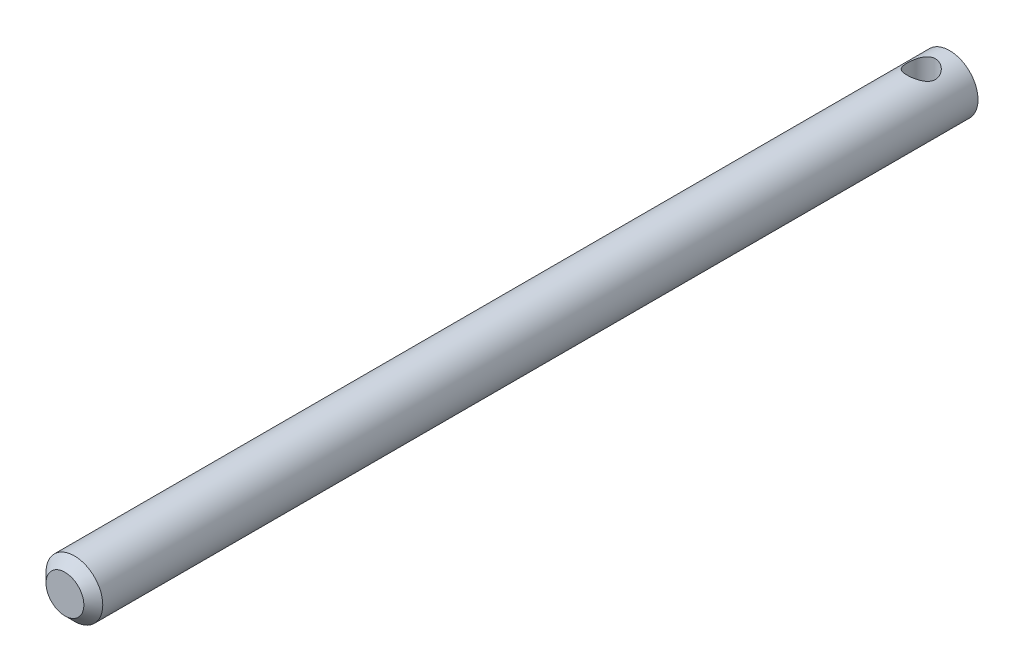
ISO-10303-21;
HEADER;
FILE_DESCRIPTION(('STEP AP214'),'2;1');
FILE_NAME('part.step','',(''),(''),'','','');
FILE_SCHEMA(('AUTOMOTIVE_DESIGN { 1 0 10303 214 1 1 1 1 }'));
ENDSEC;
DATA;
#1=APPLICATION_CONTEXT('core data for automotive mechanical design processes');
#2=APPLICATION_PROTOCOL_DEFINITION('international standard','automotive_design',2000,#1);
#3=PRODUCT_CONTEXT('',#1,'mechanical');
#4=PRODUCT('Part','Part','',(#3));
#5=PRODUCT_RELATED_PRODUCT_CATEGORY('part','',(#4));
#6=PRODUCT_DEFINITION_FORMATION('','',#4);
#7=PRODUCT_DEFINITION_CONTEXT('part definition',#1,'design');
#8=PRODUCT_DEFINITION('design','',#6,#7);
#9=PRODUCT_DEFINITION_SHAPE('','',#8);
#10=(LENGTH_UNIT() NAMED_UNIT(*) SI_UNIT(.MILLI.,.METRE.));
#11=(NAMED_UNIT(*) PLANE_ANGLE_UNIT() SI_UNIT($,.RADIAN.));
#12=(NAMED_UNIT(*) SI_UNIT($,.STERADIAN.) SOLID_ANGLE_UNIT());
#13=UNCERTAINTY_MEASURE_WITH_UNIT(LENGTH_MEASURE(1.E-05),#10,'distance_accuracy_value','');
#14=(GEOMETRIC_REPRESENTATION_CONTEXT(3) GLOBAL_UNCERTAINTY_ASSIGNED_CONTEXT((#13)) GLOBAL_UNIT_ASSIGNED_CONTEXT((#10,
#11,#12)) REPRESENTATION_CONTEXT('',''));
#15=CARTESIAN_POINT('',(0.,0.,0.));
#16=DIRECTION('',(0.,0.,1.));
#17=DIRECTION('',(1.,0.,0.));
#18=AXIS2_PLACEMENT_3D('',#15,#16,#17);
#19=CARTESIAN_POINT('',(0.,0.,93.5));
#20=DIRECTION('',(0.,0.,-1.));
#21=DIRECTION('',(-1.,0.,0.));
#22=AXIS2_PLACEMENT_3D('',#19,#20,#21);
#23=CYLINDRICAL_SURFACE('',#22,3.);
#24=CARTESIAN_POINT('',(0.,0.,92.5));
#25=DIRECTION('',(0.,0.,1.));
#26=DIRECTION('',(1.,0.,0.));
#27=AXIS2_PLACEMENT_3D('',#24,#25,#26);
#28=CIRCLE('',#27,3.);
#29=CARTESIAN_POINT('',(3.,0.,92.5));
#30=VERTEX_POINT('',#29);
#31=EDGE_CURVE('E10',#30,#30,#28,.F.);
#32=ORIENTED_EDGE('',*,*,#31,.T.);
#33=EDGE_LOOP('',(#32));
#34=FACE_BOUND('',#33,.T.);
#35=CARTESIAN_POINT('',(0.,-3.,4.5));
#36=CARTESIAN_POINT('',(0.0788579444268506,-2.99999570107562,4.49999504652421));
#37=CARTESIAN_POINT('',(0.157809899546344,-2.99685736529635,4.49374489031842));
#38=CARTESIAN_POINT('',(0.313380352903345,-2.98461234055736,4.46902067948769));
#39=CARTESIAN_POINT('',(0.389994130070445,-2.97549431743379,4.45052341050328));
#40=CARTESIAN_POINT('',(0.538400317320674,-2.95224419105063,4.40220928707506));
#41=CARTESIAN_POINT('',(0.61021020440872,-2.93813158766306,4.37243642362805));
#42=CARTESIAN_POINT('',(0.747708925209898,-2.90618664773642,4.30264406795252));
#43=CARTESIAN_POINT('',(0.813398240985089,-2.88835460450288,4.2626253836267));
#44=CARTESIAN_POINT('',(0.941261726642864,-2.84934387387093,4.17072412577207));
#45=CARTESIAN_POINT('',(1.00298281668316,-2.82802798691306,4.11827028114054));
#46=CARTESIAN_POINT('',(1.11716916730047,-2.78489955370115,4.00421778112945));
#47=CARTESIAN_POINT('',(1.16962737466015,-2.76308664313552,3.94261222234134));
#48=CARTESIAN_POINT('',(1.26787800067542,-2.71948426796021,3.80627497571493));
#49=CARTESIAN_POINT('',(1.31283800332746,-2.69782780455198,3.73089585248113));
#50=CARTESIAN_POINT('',(1.38925234033604,-2.65928968158481,3.57244899602068));
#51=CARTESIAN_POINT('',(1.4207163224495,-2.64240461410484,3.48938680691588));
#52=CARTESIAN_POINT('',(1.46719866328288,-2.61686800556713,3.32300234186712));
#53=CARTESIAN_POINT('',(1.48308878562066,-2.6077840737557,3.23999332189891));
#54=CARTESIAN_POINT('',(1.50064048996327,-2.59772834922792,3.07203174333079));
#55=CARTESIAN_POINT('',(1.50231613255961,-2.59674854014932,2.98708118869327));
#56=CARTESIAN_POINT('',(1.49203093075844,-2.60266395385873,2.82857096352695));
#57=CARTESIAN_POINT('',(1.48167683930523,-2.6086314549302,2.75486395316542));
#58=CARTESIAN_POINT('',(1.4504097735854,-2.62614343100775,2.61041713594044));
#59=CARTESIAN_POINT('',(1.42949343584648,-2.63768968247664,2.53967828204203));
#60=CARTESIAN_POINT('',(1.37731467057901,-2.66531214619112,2.40115630115151));
#61=CARTESIAN_POINT('',(1.34582260067399,-2.68148760995998,2.33348040182132));
#62=CARTESIAN_POINT('',(1.273562531502,-2.71655106422106,2.20404856111499));
#63=CARTESIAN_POINT('',(1.2327903657187,-2.73544027170286,2.14229529659987));
#64=CARTESIAN_POINT('',(1.13709908236918,-2.77669736854929,2.01821812088516));
#65=CARTESIAN_POINT('',(1.08104168755392,-2.79920265355119,1.95681468963576));
#66=CARTESIAN_POINT('',(0.959333368112061,-2.84321434950611,1.84389687211365));
#67=CARTESIAN_POINT('',(0.893677884861429,-2.86472027938201,1.79238721194918));
#68=CARTESIAN_POINT('',(0.750774758747774,-2.90552980924446,1.69847150845541));
#69=CARTESIAN_POINT('',(0.673130387399114,-2.92468476243011,1.65659929133139));
#70=CARTESIAN_POINT('',(0.510699323233196,-2.95736821681863,1.58685445643549));
#71=CARTESIAN_POINT('',(0.425918364397915,-2.9709011841533,1.55897072247725));
#72=CARTESIAN_POINT('',(0.259149737491054,-2.98986500612153,1.52028689442498));
#73=CARTESIAN_POINT('',(0.17751229582249,-2.99587407451965,1.50826314637983));
#74=CARTESIAN_POINT('',(0.0131693999240285,-3.00109520188655,1.49780290329827));
#75=CARTESIAN_POINT('',(-0.0695355298048621,-3.00031048081978,1.4993599715408));
#76=CARTESIAN_POINT('',(-0.226849457978979,-2.99236788380152,1.51531003262812));
#77=CARTESIAN_POINT('',(-0.301589112074894,-2.98570868532253,1.52869879909499));
#78=CARTESIAN_POINT('',(-0.447610338452911,-2.9673325697226,1.56635710784268));
#79=CARTESIAN_POINT('',(-0.518891528536629,-2.95561509501618,1.59062784968024));
#80=CARTESIAN_POINT('',(-0.658332912674358,-2.92776377120382,1.64999769964955));
#81=CARTESIAN_POINT('',(-0.726345595508704,-2.91151322654446,1.68538657517443));
#82=CARTESIAN_POINT('',(-0.855692042548907,-2.87615961476126,1.76566130346985));
#83=CARTESIAN_POINT('',(-0.917022944664886,-2.85705533350407,1.81055120189309));
#84=CARTESIAN_POINT('',(-1.03765153393382,-2.81562332004297,1.91364063799607));
#85=CARTESIAN_POINT('',(-1.09615811672854,-2.79316327265249,1.97271430266772));
#86=CARTESIAN_POINT('',(-1.20278448167828,-2.7489358741323,2.09988772691659));
#87=CARTESIAN_POINT('',(-1.25089707856781,-2.72716901100071,2.16799367827188));
#88=CARTESIAN_POINT('',(-1.33756187171853,-2.68576788309734,2.31546548125946));
#89=CARTESIAN_POINT('',(-1.37553824370037,-2.66628794383591,2.39521689914172));
#90=CARTESIAN_POINT('',(-1.43712423890206,-2.63361108441202,2.56126510136245));
#91=CARTESIAN_POINT('',(-1.46075237380052,-2.62040607332625,2.64755328970033));
#92=CARTESIAN_POINT('',(-1.49079253120031,-2.60342251538703,2.81536533432706));
#93=CARTESIAN_POINT('',(-1.49863949460818,-2.59886075197597,2.89655138015286));
#94=CARTESIAN_POINT('',(-1.5010337315643,-2.59748031962405,3.05917060074679));
#95=CARTESIAN_POINT('',(-1.49558676993486,-2.60065829439585,3.14060365310679));
#96=CARTESIAN_POINT('',(-1.47288918838996,-2.61356793076615,3.29322525230016));
#97=CARTESIAN_POINT('',(-1.45681247151455,-2.62264641723988,3.36465070521711));
#98=CARTESIAN_POINT('',(-1.41476303733662,-2.64556524281479,3.50371217913655));
#99=CARTESIAN_POINT('',(-1.38878713673988,-2.65940711354503,3.57134697313805));
#100=CARTESIAN_POINT('',(-1.32572361795085,-2.69142795546804,3.7059372764798));
#101=CARTESIAN_POINT('',(-1.28800670672355,-2.70983583593881,3.77254185274354));
#102=CARTESIAN_POINT('',(-1.20322645745609,-2.74852997452291,3.89891180427189));
#103=CARTESIAN_POINT('',(-1.15615825686234,-2.76881720693416,3.95867359578167));
#104=CARTESIAN_POINT('',(-1.04730498999206,-2.81193484737138,4.07721297353201));
#105=CARTESIAN_POINT('',(-0.984426634495891,-2.83477474959942,4.13498865352544));
#106=CARTESIAN_POINT('',(-0.849232209349795,-2.87816628389896,4.2393944751529));
#107=CARTESIAN_POINT('',(-0.776911084957796,-2.89871667939293,4.28601860920486));
#108=CARTESIAN_POINT('',(-0.623897395174418,-2.93547014349806,4.3668545440681));
#109=CARTESIAN_POINT('',(-0.543149255665096,-2.95164144740899,4.4009762538547));
#110=CARTESIAN_POINT('',(-0.37611315170713,-2.9775201194848,4.45471225163611));
#111=CARTESIAN_POINT('',(-0.28984169938365,-2.98724585044602,4.47436777020857));
#112=CARTESIAN_POINT('',(-0.168902919736342,-2.99543192870217,4.49084611662861));
#113=CARTESIAN_POINT('',(-0.135242819162346,-2.99714048010376,4.49427396129951));
#114=CARTESIAN_POINT('',(-0.0677275977076364,-2.99942545465223,4.49885199827113));
#115=CARTESIAN_POINT('',(-0.0338724714699419,-3.00000184655071,4.50000212770531));
#116=CARTESIAN_POINT('',(0.,-3.,4.5));
#117=B_SPLINE_CURVE_WITH_KNOTS('',3,(#35,#36,#37,#38,#39,#40,#41,#42,#43,#44,#45,#46,#47,#48,
#49,#50,#51,#52,#53,#54,#55,#56,#57,#58,#59,#60,#61,#62,#63,#64,#65,#66,#67,#68,#69,#70,#71,#72,
#73,#74,#75,#76,#77,#78,#79,#80,#81,#82,#83,#84,#85,#86,#87,#88,#89,#90,#91,#92,#93,#94,#95,#96,
#97,#98,#99,#100,#101,#102,#103,#104,#105,#106,#107,#108,#109,#110,#111,#112,#113,#114,#115,
#116),.UNSPECIFIED.,.T.,.F.,(4,2,2,2,2,2,2,2,2,2,2,2,2,2,2,2,2,2,2,2,2,2,2,2,2,2,2,2,2,2,2,2,2,
2,2,2,2,2,2,2,4),(0.,0.236436386130439,0.473322224563796,0.709293233238447,0.945245640872351,
1.19547263807713,1.44588935648105,1.71572589646129,1.98536921847421,2.23887018210344,
2.49212035993531,2.71508568613981,2.93812205888518,3.16635360252731,3.39468781890333,
3.65197412000818,3.90938301898029,4.17874533321661,4.44789325368419,4.69474935707018,
4.94148846767214,5.16910359759183,5.39674382446397,5.63089284041848,5.86514176122509,
6.12239415966628,6.37982382923148,6.64972023242589,6.91926767918176,7.1629396125457,
7.40650589797018,7.62686895373284,7.84730293182527,8.08254685170431,8.31791341715446,
8.58187864135757,8.84598575071869,9.1119602049529,9.37717362931724,9.47872920200876,
9.58028757766599),.UNSPECIFIED.);
#118=CARTESIAN_POINT('',(0.,-3.,4.5));
#119=VERTEX_POINT('',#118);
#120=EDGE_CURVE('E44',#119,#119,#117,.T.);
#121=ORIENTED_EDGE('',*,*,#120,.T.);
#122=EDGE_LOOP('',(#121));
#123=FACE_BOUND('',#122,.T.);
#124=CARTESIAN_POINT('',(0.,3.,4.5));
#125=CARTESIAN_POINT('',(-0.0788579444268503,2.99999570107561,4.49999504652421));
#126=CARTESIAN_POINT('',(-0.157809899546344,2.99685736529635,4.49374489031842));
#127=CARTESIAN_POINT('',(-0.313380352903344,2.98461234055736,4.46902067948769));
#128=CARTESIAN_POINT('',(-0.389994130070445,2.97549431743379,4.45052341050328));
#129=CARTESIAN_POINT('',(-0.538400317320674,2.95224419105063,4.40220928707506));
#130=CARTESIAN_POINT('',(-0.61021020440872,2.93813158766306,4.37243642362805));
#131=CARTESIAN_POINT('',(-0.747708925209898,2.90618664773642,4.30264406795252));
#132=CARTESIAN_POINT('',(-0.813398240985089,2.88835460450288,4.2626253836267));
#133=CARTESIAN_POINT('',(-0.941261726642864,2.84934387387093,4.17072412577207));
#134=CARTESIAN_POINT('',(-1.00298281668316,2.82802798691306,4.11827028114054));
#135=CARTESIAN_POINT('',(-1.11716916730047,2.78489955370115,4.00421778112944));
#136=CARTESIAN_POINT('',(-1.16962737466015,2.76308664313552,3.94261222234134));
#137=CARTESIAN_POINT('',(-1.26787800067542,2.71948426796021,3.80627497571493));
#138=CARTESIAN_POINT('',(-1.31283800332746,2.69782780455198,3.73089585248113));
#139=CARTESIAN_POINT('',(-1.38925234033604,2.65928968158481,3.57244899602068));
#140=CARTESIAN_POINT('',(-1.4207163224495,2.64240461410484,3.48938680691588));
#141=CARTESIAN_POINT('',(-1.46719866328288,2.61686800556713,3.32300234186712));
#142=CARTESIAN_POINT('',(-1.48308878562066,2.6077840737557,3.23999332189891));
#143=CARTESIAN_POINT('',(-1.50064048996327,2.59772834922792,3.07203174333078));
#144=CARTESIAN_POINT('',(-1.50231613255961,2.59674854014932,2.98708118869327));
#145=CARTESIAN_POINT('',(-1.49203093075844,2.60266395385873,2.82857096352695));
#146=CARTESIAN_POINT('',(-1.48167683930523,2.6086314549302,2.75486395316542));
#147=CARTESIAN_POINT('',(-1.4504097735854,2.62614343100775,2.61041713594044));
#148=CARTESIAN_POINT('',(-1.42949343584648,2.63768968247664,2.53967828204203));
#149=CARTESIAN_POINT('',(-1.377314670579,2.66531214619112,2.40115630115151));
#150=CARTESIAN_POINT('',(-1.34582260067399,2.68148760995998,2.33348040182132));
#151=CARTESIAN_POINT('',(-1.273562531502,2.71655106422106,2.20404856111499));
#152=CARTESIAN_POINT('',(-1.2327903657187,2.73544027170286,2.14229529659987));
#153=CARTESIAN_POINT('',(-1.13709908236918,2.77669736854929,2.01821812088516));
#154=CARTESIAN_POINT('',(-1.08104168755392,2.79920265355119,1.95681468963576));
#155=CARTESIAN_POINT('',(-0.959333368112059,2.84321434950611,1.84389687211365));
#156=CARTESIAN_POINT('',(-0.893677884861427,2.86472027938201,1.79238721194918));
#157=CARTESIAN_POINT('',(-0.750774758747771,2.90552980924446,1.69847150845541));
#158=CARTESIAN_POINT('',(-0.673130387399112,2.92468476243011,1.65659929133139));
#159=CARTESIAN_POINT('',(-0.510699323233194,2.95736821681863,1.58685445643549));
#160=CARTESIAN_POINT('',(-0.425918364397913,2.9709011841533,1.55897072247725));
#161=CARTESIAN_POINT('',(-0.259149737491052,2.98986500612153,1.52028689442498));
#162=CARTESIAN_POINT('',(-0.177512295822488,2.99587407451965,1.50826314637983));
#163=CARTESIAN_POINT('',(-0.0131693999240264,3.00109520188655,1.49780290329827));
#164=CARTESIAN_POINT('',(0.0695355298048642,3.00031048081978,1.4993599715408));
#165=CARTESIAN_POINT('',(0.226849457978982,2.99236788380152,1.51531003262812));
#166=CARTESIAN_POINT('',(0.301589112074896,2.98570868532252,1.52869879909499));
#167=CARTESIAN_POINT('',(0.447610338452913,2.9673325697226,1.56635710784268));
#168=CARTESIAN_POINT('',(0.518891528536632,2.95561509501618,1.59062784968024));
#169=CARTESIAN_POINT('',(0.65833291267436,2.92776377120382,1.64999769964955));
#170=CARTESIAN_POINT('',(0.726345595508706,2.91151322654446,1.68538657517443));
#171=CARTESIAN_POINT('',(0.855692042548909,2.87615961476126,1.76566130346985));
#172=CARTESIAN_POINT('',(0.917022944664889,2.85705533350407,1.81055120189309));
#173=CARTESIAN_POINT('',(1.03765153393382,2.81562332004297,1.91364063799608));
#174=CARTESIAN_POINT('',(1.09615811672854,2.79316327265249,1.97271430266772));
#175=CARTESIAN_POINT('',(1.20278448167828,2.7489358741323,2.09988772691659));
#176=CARTESIAN_POINT('',(1.25089707856781,2.72716901100071,2.16799367827188));
#177=CARTESIAN_POINT('',(1.33756187171853,2.68576788309734,2.31546548125946));
#178=CARTESIAN_POINT('',(1.37553824370037,2.66628794383591,2.39521689914172));
#179=CARTESIAN_POINT('',(1.43712423890206,2.63361108441202,2.56126510136245));
#180=CARTESIAN_POINT('',(1.46075237380053,2.62040607332625,2.64755328970034));
#181=CARTESIAN_POINT('',(1.49079253120031,2.60342251538703,2.81536533432706));
#182=CARTESIAN_POINT('',(1.49863949460818,2.59886075197597,2.89655138015286));
#183=CARTESIAN_POINT('',(1.5010337315643,2.59748031962405,3.05917060074679));
#184=CARTESIAN_POINT('',(1.49558676993486,2.60065829439585,3.14060365310679));
#185=CARTESIAN_POINT('',(1.47288918838996,2.61356793076615,3.29322525230016));
#186=CARTESIAN_POINT('',(1.45681247151455,2.62264641723988,3.36465070521711));
#187=CARTESIAN_POINT('',(1.41476303733662,2.64556524281479,3.50371217913655));
#188=CARTESIAN_POINT('',(1.38878713673988,2.65940711354503,3.57134697313805));
#189=CARTESIAN_POINT('',(1.32572361795085,2.69142795546804,3.70593727647981));
#190=CARTESIAN_POINT('',(1.28800670672355,2.70983583593881,3.77254185274354));
#191=CARTESIAN_POINT('',(1.20322645745609,2.74852997452291,3.89891180427189));
#192=CARTESIAN_POINT('',(1.15615825686234,2.76881720693416,3.95867359578167));
#193=CARTESIAN_POINT('',(1.04730498999206,2.81193484737138,4.07721297353201));
#194=CARTESIAN_POINT('',(0.984426634495891,2.83477474959942,4.13498865352544));
#195=CARTESIAN_POINT('',(0.849232209349795,2.87816628389896,4.2393944751529));
#196=CARTESIAN_POINT('',(0.776911084957795,2.89871667939293,4.28601860920486));
#197=CARTESIAN_POINT('',(0.623897395174418,2.93547014349806,4.36685454406811));
#198=CARTESIAN_POINT('',(0.543149255665095,2.95164144740899,4.4009762538547));
#199=CARTESIAN_POINT('',(0.376113151707129,2.9775201194848,4.45471225163611));
#200=CARTESIAN_POINT('',(0.289841699383649,2.98724585044602,4.47436777020857));
#201=CARTESIAN_POINT('',(0.168902919736342,2.99543192870217,4.49084611662861));
#202=CARTESIAN_POINT('',(0.135242819162346,2.99714048010376,4.49427396129951));
#203=CARTESIAN_POINT('',(0.0677275977076367,2.99942545465223,4.49885199827113));
#204=CARTESIAN_POINT('',(0.0338724714699423,3.00000184655071,4.50000212770531));
#205=CARTESIAN_POINT('',(0.,3.,4.5));
#206=B_SPLINE_CURVE_WITH_KNOTS('',3,(#124,#125,#126,#127,#128,#129,#130,#131,#132,#133,#134,
#135,#136,#137,#138,#139,#140,#141,#142,#143,#144,#145,#146,#147,#148,#149,#150,#151,#152,#153,
#154,#155,#156,#157,#158,#159,#160,#161,#162,#163,#164,#165,#166,#167,#168,#169,#170,#171,#172,
#173,#174,#175,#176,#177,#178,#179,#180,#181,#182,#183,#184,#185,#186,#187,#188,#189,#190,#191,
#192,#193,#194,#195,#196,#197,#198,#199,#200,#201,#202,#203,#204,#205),.UNSPECIFIED.,.T.,.F.,(4,
2,2,2,2,2,2,2,2,2,2,2,2,2,2,2,2,2,2,2,2,2,2,2,2,2,2,2,2,2,2,2,2,2,2,2,2,2,2,2,4),(0.,
0.236436386130439,0.473322224563797,0.709293233238448,0.945245640872352,1.19547263807713,
1.44588935648105,1.71572589646129,1.98536921847421,2.23887018210344,2.49212035993531,
2.71508568613981,2.93812205888518,3.16635360252731,3.39468781890333,3.65197412000818,
3.9093830189803,4.17874533321661,4.44789325368419,4.69474935707018,4.94148846767214,
5.16910359759183,5.39674382446397,5.63089284041848,5.86514176122509,6.12239415966628,
6.37982382923148,6.64972023242589,6.91926767918176,7.1629396125457,7.40650589797018,
7.62686895373284,7.84730293182527,8.08254685170431,8.31791341715446,8.58187864135757,
8.84598575071869,9.1119602049529,9.37717362931724,9.47872920200875,9.58028757766599),.UNSPECIFIED.);
#207=CARTESIAN_POINT('',(0.,3.,4.5));
#208=VERTEX_POINT('',#207);
#209=EDGE_CURVE('E48',#208,#208,#206,.T.);
#210=ORIENTED_EDGE('',*,*,#209,.T.);
#211=EDGE_LOOP('',(#210));
#212=FACE_BOUND('',#211,.T.);
#213=CARTESIAN_POINT('',(0.,0.,0.));
#214=DIRECTION('',(0.,0.,1.));
#215=DIRECTION('',(1.,0.,0.));
#216=AXIS2_PLACEMENT_3D('',#213,#214,#215);
#217=CIRCLE('',#216,3.);
#218=CARTESIAN_POINT('',(3.,0.,0.));
#219=VERTEX_POINT('',#218);
#220=EDGE_CURVE('E83',#219,#219,#217,.T.);
#221=ORIENTED_EDGE('',*,*,#220,.T.);
#222=EDGE_LOOP('',(#221));
#223=FACE_BOUND('',#222,.T.);
#224=ADVANCED_FACE('F33',(#34,#123,#212,#223),#23,.T.);
#225=CARTESIAN_POINT('',(0.,0.,93.5));
#226=DIRECTION('',(0.,0.,1.));
#227=DIRECTION('',(1.,0.,0.));
#228=AXIS2_PLACEMENT_3D('',#225,#226,#227);
#229=PLANE('',#228);
#230=CARTESIAN_POINT('',(0.,0.,93.5));
#231=DIRECTION('',(0.,0.,1.));
#232=DIRECTION('',(1.,0.,0.));
#233=AXIS2_PLACEMENT_3D('',#230,#231,#232);
#234=CIRCLE('',#233,2.00000000000003);
#235=CARTESIAN_POINT('',(2.00000000000003,0.,93.5));
#236=VERTEX_POINT('',#235);
#237=EDGE_CURVE('E40',#236,#236,#234,.T.);
#238=ORIENTED_EDGE('',*,*,#237,.T.);
#239=EDGE_LOOP('',(#238));
#240=FACE_BOUND('',#239,.T.);
#241=ADVANCED_FACE('F65',(#240),#229,.T.);
#242=CARTESIAN_POINT('',(0.,0.,0.));
#243=DIRECTION('',(0.,0.,1.));
#244=DIRECTION('',(1.,0.,0.));
#245=AXIS2_PLACEMENT_3D('',#242,#243,#244);
#246=PLANE('',#245);
#247=ORIENTED_EDGE('',*,*,#220,.F.);
#248=EDGE_LOOP('',(#247));
#249=FACE_BOUND('',#248,.T.);
#250=ADVANCED_FACE('F63',(#249),#246,.F.);
#251=CARTESIAN_POINT('',(0.,-3.,3.));
#252=DIRECTION('',(0.,1.,0.));
#253=DIRECTION('',(0.,0.,1.));
#254=AXIS2_PLACEMENT_3D('',#251,#252,#253);
#255=CYLINDRICAL_SURFACE('',#254,1.5);
#256=ORIENTED_EDGE('',*,*,#209,.F.);
#257=EDGE_LOOP('',(#256));
#258=FACE_BOUND('',#257,.T.);
#259=ORIENTED_EDGE('',*,*,#120,.F.);
#260=EDGE_LOOP('',(#259));
#261=FACE_BOUND('',#260,.T.);
#262=ADVANCED_FACE('F59',(#258,#261),#255,.F.);
#263=CARTESIAN_POINT('',(0.,0.,93.5));
#264=DIRECTION('',(0.,0.,-1.));
#265=DIRECTION('',(-1.,0.,0.));
#266=AXIS2_PLACEMENT_3D('',#263,#264,#265);
#267=CONICAL_SURFACE('',#266,2.00000000000003,0.78539816339744);
#268=ORIENTED_EDGE('',*,*,#31,.F.);
#269=EDGE_LOOP('',(#268));
#270=FACE_BOUND('',#269,.T.);
#271=ORIENTED_EDGE('',*,*,#237,.F.);
#272=EDGE_LOOP('',(#271));
#273=FACE_BOUND('',#272,.T.);
#274=ADVANCED_FACE('F35',(#270,#273),#267,.T.);
#275=CLOSED_SHELL('',(#224,#241,#250,#262,#274));
#276=MANIFOLD_SOLID_BREP('B2',#275);
#277=ADVANCED_BREP_SHAPE_REPRESENTATION('',(#18,#276),#14);
#278=SHAPE_DEFINITION_REPRESENTATION(#9,#277);
ENDSEC;
END-ISO-10303-21;
